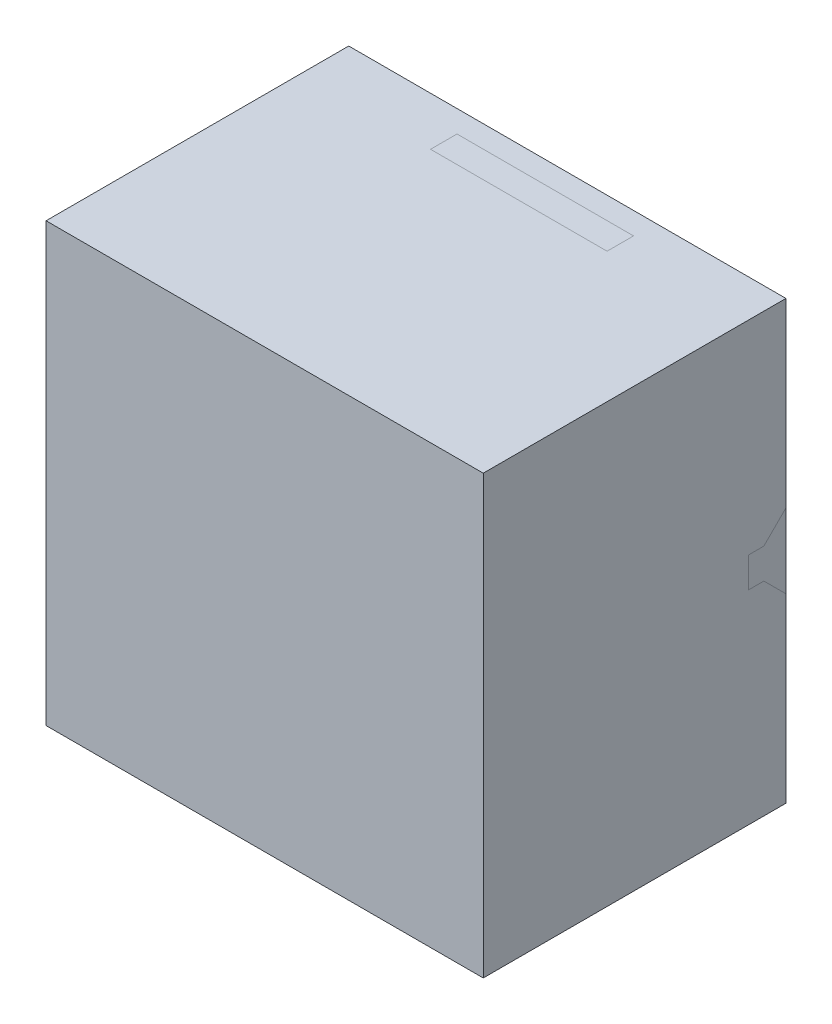
ISO-10303-21;
HEADER;
FILE_DESCRIPTION(('STEP AP214'),'2;1');
FILE_NAME('part.step','',(''),(''),'','','');
FILE_SCHEMA(('AUTOMOTIVE_DESIGN { 1 0 10303 214 1 1 1 1 }'));
ENDSEC;
DATA;
#1=APPLICATION_CONTEXT('core data for automotive mechanical design processes');
#2=APPLICATION_PROTOCOL_DEFINITION('international standard','automotive_design',2000,#1);
#3=PRODUCT_CONTEXT('',#1,'mechanical');
#4=PRODUCT('Part','Part','',(#3));
#5=PRODUCT_RELATED_PRODUCT_CATEGORY('part','',(#4));
#6=PRODUCT_DEFINITION_FORMATION('','',#4);
#7=PRODUCT_DEFINITION_CONTEXT('part definition',#1,'design');
#8=PRODUCT_DEFINITION('design','',#6,#7);
#9=PRODUCT_DEFINITION_SHAPE('','',#8);
#10=(LENGTH_UNIT() NAMED_UNIT(*) SI_UNIT(.MILLI.,.METRE.));
#11=(NAMED_UNIT(*) PLANE_ANGLE_UNIT() SI_UNIT($,.RADIAN.));
#12=(NAMED_UNIT(*) SI_UNIT($,.STERADIAN.) SOLID_ANGLE_UNIT());
#13=UNCERTAINTY_MEASURE_WITH_UNIT(LENGTH_MEASURE(1.E-05),#10,'distance_accuracy_value','');
#14=(GEOMETRIC_REPRESENTATION_CONTEXT(3) GLOBAL_UNCERTAINTY_ASSIGNED_CONTEXT((#13)) GLOBAL_UNIT_ASSIGNED_CONTEXT((#10,
#11,#12)) REPRESENTATION_CONTEXT('',''));
#15=CARTESIAN_POINT('',(0.,0.,0.));
#16=DIRECTION('',(0.,0.,1.));
#17=DIRECTION('',(1.,0.,0.));
#18=AXIS2_PLACEMENT_3D('',#15,#16,#17);
#19=CARTESIAN_POINT('',(49.53,49.53,68.58));
#20=DIRECTION('',(-1.,0.,0.));
#21=DIRECTION('',(0.,-1.,0.));
#22=AXIS2_PLACEMENT_3D('',#19,#20,#21);
#23=PLANE('',#22);
#24=DIRECTION('',(0.,-0.707106781186549,0.707106781186546));
#25=VECTOR('',#24,1.);
#26=CARTESIAN_POINT('',(49.53,-5.31049999999991,13.7394999999999));
#27=LINE('',#26,#25);
#28=CARTESIAN_POINT('',(49.53,8.42900000000003,0.));
#29=VERTEX_POINT('',#28);
#30=CARTESIAN_POINT('',(49.53,3.42900000000001,5.));
#31=VERTEX_POINT('',#30);
#32=EDGE_CURVE('E11',#29,#31,#27,.T.);
#33=ORIENTED_EDGE('',*,*,#32,.F.);
#34=DIRECTION('',(0.,1.,0.));
#35=VECTOR('',#34,1.);
#36=CARTESIAN_POINT('',(49.53,49.53,0.));
#37=LINE('',#36,#35);
#38=CARTESIAN_POINT('',(49.53,49.53,0.));
#39=VERTEX_POINT('',#38);
#40=EDGE_CURVE('E188',#29,#39,#37,.T.);
#41=ORIENTED_EDGE('',*,*,#40,.T.);
#42=DIRECTION('',(0.,0.,-1.));
#43=VECTOR('',#42,1.);
#44=CARTESIAN_POINT('',(49.53,49.53,68.58));
#45=LINE('',#44,#43);
#46=CARTESIAN_POINT('',(49.53,49.53,68.58));
#47=VERTEX_POINT('',#46);
#48=EDGE_CURVE('E168',#47,#39,#45,.T.);
#49=ORIENTED_EDGE('',*,*,#48,.F.);
#50=DIRECTION('',(0.,1.,0.));
#51=VECTOR('',#50,1.);
#52=CARTESIAN_POINT('',(49.53,49.53,68.58));
#53=LINE('',#52,#51);
#54=CARTESIAN_POINT('',(49.53,-49.53,68.58));
#55=VERTEX_POINT('',#54);
#56=EDGE_CURVE('E175',#55,#47,#53,.T.);
#57=ORIENTED_EDGE('',*,*,#56,.F.);
#58=DIRECTION('',(0.,0.,-1.));
#59=VECTOR('',#58,1.);
#60=CARTESIAN_POINT('',(49.53,-49.53,68.58));
#61=LINE('',#60,#59);
#62=CARTESIAN_POINT('',(49.53,-49.53,0.));
#63=VERTEX_POINT('',#62);
#64=EDGE_CURVE('E378',#55,#63,#61,.T.);
#65=ORIENTED_EDGE('',*,*,#64,.T.);
#66=CARTESIAN_POINT('',(49.53,-8.42900000000003,0.));
#67=VERTEX_POINT('',#66);
#68=EDGE_CURVE('E357',#63,#67,#37,.T.);
#69=ORIENTED_EDGE('',*,*,#68,.T.);
#70=DIRECTION('',(0.,-0.707106781186549,-0.707106781186546));
#71=VECTOR('',#70,1.);
#72=CARTESIAN_POINT('',(49.53,54.8405000000001,63.2694999999999));
#73=LINE('',#72,#71);
#74=CARTESIAN_POINT('',(49.53,-3.42900000000001,5.));
#75=VERTEX_POINT('',#74);
#76=EDGE_CURVE('E266',#75,#67,#73,.T.);
#77=ORIENTED_EDGE('',*,*,#76,.F.);
#78=DIRECTION('',(0.,0.,-1.));
#79=VECTOR('',#78,1.);
#80=CARTESIAN_POINT('',(49.53,-3.42899999999999,68.58));
#81=LINE('',#80,#79);
#82=CARTESIAN_POINT('',(49.53,-3.42899999999999,8.429));
#83=VERTEX_POINT('',#82);
#84=EDGE_CURVE('E269',#83,#75,#81,.T.);
#85=ORIENTED_EDGE('',*,*,#84,.F.);
#86=DIRECTION('',(0.,-1.,0.));
#87=VECTOR('',#86,1.);
#88=CARTESIAN_POINT('',(49.53,49.53,8.429));
#89=LINE('',#88,#87);
#90=CARTESIAN_POINT('',(49.53,3.42900000000001,8.429));
#91=VERTEX_POINT('',#90);
#92=EDGE_CURVE('E272',#91,#83,#89,.T.);
#93=ORIENTED_EDGE('',*,*,#92,.F.);
#94=DIRECTION('',(0.,0.,1.));
#95=VECTOR('',#94,1.);
#96=CARTESIAN_POINT('',(49.53,3.42900000000001,68.58));
#97=LINE('',#96,#95);
#98=EDGE_CURVE('E55',#31,#91,#97,.T.);
#99=ORIENTED_EDGE('',*,*,#98,.F.);
#100=EDGE_LOOP('',(#33,#41,#49,#57,#65,#69,#77,#85,#93,#99));
#101=FACE_BOUND('',#100,.T.);
#102=ADVANCED_FACE('F46',(#101),#23,.F.);
#103=CARTESIAN_POINT('',(-49.53,49.53,68.58));
#104=DIRECTION('',(0.,-1.,0.));
#105=DIRECTION('',(0.,0.,-1.));
#106=AXIS2_PLACEMENT_3D('',#103,#104,#105);
#107=PLANE('',#106);
#108=DIRECTION('',(-1.,0.,0.));
#109=VECTOR('',#108,1.);
#110=CARTESIAN_POINT('',(-49.53,49.53,0.));
#111=LINE('',#110,#109);
#112=CARTESIAN_POINT('',(-49.53,49.53,0.));
#113=VERTEX_POINT('',#112);
#114=EDGE_CURVE('E367',#39,#113,#111,.T.);
#115=ORIENTED_EDGE('',*,*,#114,.T.);
#116=DIRECTION('',(0.,0.,-1.));
#117=VECTOR('',#116,1.);
#118=CARTESIAN_POINT('',(-49.53,49.53,68.58));
#119=LINE('',#118,#117);
#120=CARTESIAN_POINT('',(-49.53,49.53,68.58));
#121=VERTEX_POINT('',#120);
#122=EDGE_CURVE('E170',#121,#113,#119,.T.);
#123=ORIENTED_EDGE('',*,*,#122,.F.);
#124=DIRECTION('',(-1.,0.,0.));
#125=VECTOR('',#124,1.);
#126=CARTESIAN_POINT('',(-49.53,49.53,68.58));
#127=LINE('',#126,#125);
#128=EDGE_CURVE('E163',#47,#121,#127,.T.);
#129=ORIENTED_EDGE('',*,*,#128,.F.);
#130=ORIENTED_EDGE('',*,*,#48,.T.);
#131=EDGE_LOOP('',(#115,#123,#129,#130));
#132=FACE_BOUND('',#131,.T.);
#133=DIRECTION('',(0.,0.,1.));
#134=VECTOR('',#133,1.);
#135=CARTESIAN_POINT('',(-20.,49.53,68.58));
#136=LINE('',#135,#134);
#137=CARTESIAN_POINT('',(-20.,49.53,5.00000000000002));
#138=VERTEX_POINT('',#137);
#139=CARTESIAN_POINT('',(-20.,49.53,11.));
#140=VERTEX_POINT('',#139);
#141=EDGE_CURVE('E263',#138,#140,#136,.T.);
#142=ORIENTED_EDGE('',*,*,#141,.F.);
#143=DIRECTION('',(-1.,0.,0.));
#144=VECTOR('',#143,1.);
#145=CARTESIAN_POINT('',(-49.53,49.53,5.00000000000002));
#146=LINE('',#145,#144);
#147=CARTESIAN_POINT('',(20.,49.53,5.00000000000002));
#148=VERTEX_POINT('',#147);
#149=EDGE_CURVE('E253',#148,#138,#146,.T.);
#150=ORIENTED_EDGE('',*,*,#149,.F.);
#151=DIRECTION('',(0.,0.,-1.));
#152=VECTOR('',#151,1.);
#153=CARTESIAN_POINT('',(20.,49.53,68.58));
#154=LINE('',#153,#152);
#155=CARTESIAN_POINT('',(20.,49.53,11.));
#156=VERTEX_POINT('',#155);
#157=EDGE_CURVE('E257',#156,#148,#154,.T.);
#158=ORIENTED_EDGE('',*,*,#157,.F.);
#159=DIRECTION('',(1.,0.,0.));
#160=VECTOR('',#159,1.);
#161=CARTESIAN_POINT('',(-49.53,49.53,11.));
#162=LINE('',#161,#160);
#163=EDGE_CURVE('E260',#140,#156,#162,.T.);
#164=ORIENTED_EDGE('',*,*,#163,.F.);
#165=EDGE_LOOP('',(#142,#150,#158,#164));
#166=FACE_BOUND('',#165,.T.);
#167=ADVANCED_FACE('F165',(#132,#166),#107,.F.);
#168=CARTESIAN_POINT('',(-49.53,49.53,68.58));
#169=DIRECTION('',(1.,0.,0.));
#170=DIRECTION('',(0.,1.,0.));
#171=AXIS2_PLACEMENT_3D('',#168,#169,#170);
#172=PLANE('',#171);
#173=CARTESIAN_POINT('',(-49.53,-21.9833914790969,31.3953335520591));
#174=DIRECTION('',(1.,0.,0.));
#175=DIRECTION('',(0.,1.,0.));
#176=AXIS2_PLACEMENT_3D('',#173,#174,#175);
#177=CIRCLE('',#176,6.91833197341886);
#178=CARTESIAN_POINT('',(-49.53,-15.065059505678,31.3953335520591));
#179=VERTEX_POINT('',#178);
#180=EDGE_CURVE('E236',#179,#179,#177,.F.);
#181=ORIENTED_EDGE('',*,*,#180,.F.);
#182=EDGE_LOOP('',(#181));
#183=FACE_BOUND('',#182,.T.);
#184=DIRECTION('',(0.,0.,-1.));
#185=VECTOR('',#184,1.);
#186=CARTESIAN_POINT('',(-49.53,-15.065059505678,68.58));
#187=LINE('',#186,#185);
#188=CARTESIAN_POINT('',(-49.53,-15.065059505678,53.735712572944));
#189=VERTEX_POINT('',#188);
#190=CARTESIAN_POINT('',(-49.53,-15.065059505678,39.1675779674298));
#191=VERTEX_POINT('',#190);
#192=EDGE_CURVE('E233',#189,#191,#187,.T.);
#193=ORIENTED_EDGE('',*,*,#192,.F.);
#194=DIRECTION('',(0.,1.,0.));
#195=VECTOR('',#194,1.);
#196=CARTESIAN_POINT('',(-49.53,49.53,53.735712572944));
#197=LINE('',#196,#195);
#198=CARTESIAN_POINT('',(-49.53,-33.2789971849568,53.735712572944));
#199=VERTEX_POINT('',#198);
#200=EDGE_CURVE('E223',#199,#189,#197,.T.);
#201=ORIENTED_EDGE('',*,*,#200,.F.);
#202=DIRECTION('',(0.,0.,1.));
#203=VECTOR('',#202,1.);
#204=CARTESIAN_POINT('',(-49.53,-33.2789971849568,68.58));
#205=LINE('',#204,#203);
#206=CARTESIAN_POINT('',(-49.53,-33.2789971849568,39.1675779674298));
#207=VERTEX_POINT('',#206);
#208=EDGE_CURVE('E227',#207,#199,#205,.T.);
#209=ORIENTED_EDGE('',*,*,#208,.F.);
#210=DIRECTION('',(0.,-1.,0.));
#211=VECTOR('',#210,1.);
#212=CARTESIAN_POINT('',(-49.53,49.53,39.1675779674298));
#213=LINE('',#212,#211);
#214=EDGE_CURVE('E230',#191,#207,#213,.T.);
#215=ORIENTED_EDGE('',*,*,#214,.F.);
#216=EDGE_LOOP('',(#193,#201,#209,#215));
#217=FACE_BOUND('',#216,.T.);
#218=DIRECTION('',(0.,-1.,0.));
#219=VECTOR('',#218,1.);
#220=CARTESIAN_POINT('',(-49.53,49.53,59.055));
#221=LINE('',#220,#219);
#222=CARTESIAN_POINT('',(-49.53,34.29,59.055));
#223=VERTEX_POINT('',#222);
#224=CARTESIAN_POINT('',(-49.53,-34.29,59.055));
#225=VERTEX_POINT('',#224);
#226=EDGE_CURVE('E207',#223,#225,#221,.T.);
#227=ORIENTED_EDGE('',*,*,#226,.F.);
#228=DIRECTION('',(0.,0.,-1.));
#229=VECTOR('',#228,1.);
#230=CARTESIAN_POINT('',(-49.53,34.29,68.58));
#231=LINE('',#230,#229);
#232=CARTESIAN_POINT('',(-49.53,34.29,65.405));
#233=VERTEX_POINT('',#232);
#234=EDGE_CURVE('E191',#233,#223,#231,.T.);
#235=ORIENTED_EDGE('',*,*,#234,.F.);
#236=DIRECTION('',(0.,1.,0.));
#237=VECTOR('',#236,1.);
#238=CARTESIAN_POINT('',(-49.53,49.53,65.405));
#239=LINE('',#238,#237);
#240=CARTESIAN_POINT('',(-49.53,-34.29,65.405));
#241=VERTEX_POINT('',#240);
#242=EDGE_CURVE('E196',#241,#233,#239,.T.);
#243=ORIENTED_EDGE('',*,*,#242,.F.);
#244=DIRECTION('',(0.,0.,1.));
#245=VECTOR('',#244,1.);
#246=CARTESIAN_POINT('',(-49.53,-34.29,68.58));
#247=LINE('',#246,#245);
#248=EDGE_CURVE('E204',#225,#241,#247,.T.);
#249=ORIENTED_EDGE('',*,*,#248,.F.);
#250=EDGE_LOOP('',(#227,#235,#243,#249));
#251=FACE_BOUND('',#250,.T.);
#252=DIRECTION('',(0.,-1.,0.));
#253=VECTOR('',#252,1.);
#254=CARTESIAN_POINT('',(-49.53,49.53,0.));
#255=LINE('',#254,#253);
#256=CARTESIAN_POINT('',(-49.53,-49.53,0.));
#257=VERTEX_POINT('',#256);
#258=EDGE_CURVE('E373',#113,#257,#255,.T.);
#259=ORIENTED_EDGE('',*,*,#258,.T.);
#260=DIRECTION('',(0.,0.,-1.));
#261=VECTOR('',#260,1.);
#262=CARTESIAN_POINT('',(-49.53,-49.53,68.58));
#263=LINE('',#262,#261);
#264=CARTESIAN_POINT('',(-49.53,-49.53,68.58));
#265=VERTEX_POINT('',#264);
#266=EDGE_CURVE('E198',#265,#257,#263,.T.);
#267=ORIENTED_EDGE('',*,*,#266,.F.);
#268=DIRECTION('',(0.,-1.,0.));
#269=VECTOR('',#268,1.);
#270=CARTESIAN_POINT('',(-49.53,49.53,68.58));
#271=LINE('',#270,#269);
#272=EDGE_CURVE('E174',#121,#265,#271,.T.);
#273=ORIENTED_EDGE('',*,*,#272,.F.);
#274=ORIENTED_EDGE('',*,*,#122,.T.);
#275=EDGE_LOOP('',(#259,#267,#273,#274));
#276=FACE_BOUND('',#275,.T.);
#277=DIRECTION('',(0.,-1.,0.));
#278=VECTOR('',#277,1.);
#279=CARTESIAN_POINT('',(-49.53,49.53,22.9737894492445));
#280=LINE('',#279,#278);
#281=CARTESIAN_POINT('',(-49.53,34.0803020450621,22.9737894492445));
#282=VERTEX_POINT('',#281);
#283=CARTESIAN_POINT('',(-49.53,-12.2746979549379,22.9737894492445));
#284=VERTEX_POINT('',#283);
#285=EDGE_CURVE('E220',#282,#284,#280,.T.);
#286=ORIENTED_EDGE('',*,*,#285,.F.);
#287=DIRECTION('',(0.,0.,-1.));
#288=VECTOR('',#287,1.);
#289=CARTESIAN_POINT('',(-49.53,34.0803020450621,68.58));
#290=LINE('',#289,#288);
#291=CARTESIAN_POINT('',(-49.53,34.0803020450621,51.5237150325915));
#292=VERTEX_POINT('',#291);
#293=EDGE_CURVE('E210',#292,#282,#290,.T.);
#294=ORIENTED_EDGE('',*,*,#293,.F.);
#295=DIRECTION('',(0.,1.,0.));
#296=VECTOR('',#295,1.);
#297=CARTESIAN_POINT('',(-49.53,49.53,51.5237150325915));
#298=LINE('',#297,#296);
#299=CARTESIAN_POINT('',(-49.53,-12.2746979549379,51.5237150325915));
#300=VERTEX_POINT('',#299);
#301=EDGE_CURVE('E214',#300,#292,#298,.T.);
#302=ORIENTED_EDGE('',*,*,#301,.F.);
#303=DIRECTION('',(0.,0.,1.));
#304=VECTOR('',#303,1.);
#305=CARTESIAN_POINT('',(-49.53,-12.2746979549379,68.58));
#306=LINE('',#305,#304);
#307=EDGE_CURVE('E217',#284,#300,#306,.T.);
#308=ORIENTED_EDGE('',*,*,#307,.F.);
#309=EDGE_LOOP('',(#286,#294,#302,#308));
#310=FACE_BOUND('',#309,.T.);
#311=DIRECTION('',(0.,0.,-1.));
#312=VECTOR('',#311,1.);
#313=CARTESIAN_POINT('',(-49.53,39.583984455087,68.58));
#314=LINE('',#313,#312);
#315=CARTESIAN_POINT('',(-49.53,39.583984455087,19.7319548024756));
#316=VERTEX_POINT('',#315);
#317=CARTESIAN_POINT('',(-49.53,39.583984455087,9.08096337334348));
#318=VERTEX_POINT('',#317);
#319=EDGE_CURVE('E250',#316,#318,#314,.T.);
#320=ORIENTED_EDGE('',*,*,#319,.F.);
#321=DIRECTION('',(0.,1.,0.));
#322=VECTOR('',#321,1.);
#323=CARTESIAN_POINT('',(-49.53,49.53,19.7319548024756));
#324=LINE('',#323,#322);
#325=CARTESIAN_POINT('',(-49.53,-39.651135160333,19.7319548024756));
#326=VERTEX_POINT('',#325);
#327=EDGE_CURVE('E240',#326,#316,#324,.T.);
#328=ORIENTED_EDGE('',*,*,#327,.F.);
#329=DIRECTION('',(0.,0.,1.));
#330=VECTOR('',#329,1.);
#331=CARTESIAN_POINT('',(-49.53,-39.651135160333,68.5799999999999));
#332=LINE('',#331,#330);
#333=CARTESIAN_POINT('',(-49.53,-39.651135160333,9.08096337334348));
#334=VERTEX_POINT('',#333);
#335=EDGE_CURVE('E244',#334,#326,#332,.T.);
#336=ORIENTED_EDGE('',*,*,#335,.F.);
#337=DIRECTION('',(0.,-1.,0.));
#338=VECTOR('',#337,1.);
#339=CARTESIAN_POINT('',(-49.53,49.53,9.08096337334348));
#340=LINE('',#339,#338);
#341=EDGE_CURVE('E247',#318,#334,#340,.T.);
#342=ORIENTED_EDGE('',*,*,#341,.F.);
#343=EDGE_LOOP('',(#320,#328,#336,#342));
#344=FACE_BOUND('',#343,.T.);
#345=ADVANCED_FACE('F387',(#183,#217,#251,#276,#310,#344),#172,.F.);
#346=ORIENTED_EDGE('',*,*,#327,.T.);
#347=ORIENTED_EDGE('',*,*,#319,.T.);
#348=ORIENTED_EDGE('',*,*,#341,.T.);
#349=ORIENTED_EDGE('',*,*,#335,.T.);
#350=EDGE_LOOP('',(#346,#347,#348,#349));
#351=FACE_BOUND('',#350,.T.);
#352=ADVANCED_FACE('F392',(#351),#172,.F.);
#353=ORIENTED_EDGE('',*,*,#180,.T.);
#354=EDGE_LOOP('',(#353));
#355=FACE_BOUND('',#354,.T.);
#356=ADVANCED_FACE('F404',(#355),#172,.F.);
#357=ORIENTED_EDGE('',*,*,#200,.T.);
#358=ORIENTED_EDGE('',*,*,#192,.T.);
#359=ORIENTED_EDGE('',*,*,#214,.T.);
#360=ORIENTED_EDGE('',*,*,#208,.T.);
#361=EDGE_LOOP('',(#357,#358,#359,#360));
#362=FACE_BOUND('',#361,.T.);
#363=ADVANCED_FACE('F408',(#362),#172,.F.);
#364=ORIENTED_EDGE('',*,*,#293,.T.);
#365=ORIENTED_EDGE('',*,*,#285,.T.);
#366=ORIENTED_EDGE('',*,*,#307,.T.);
#367=ORIENTED_EDGE('',*,*,#301,.T.);
#368=EDGE_LOOP('',(#364,#365,#366,#367));
#369=FACE_BOUND('',#368,.T.);
#370=ADVANCED_FACE('F417',(#369),#172,.F.);
#371=EDGE_CURVE('E359',#67,#29,#37,.T.);
#372=ORIENTED_EDGE('',*,*,#371,.T.);
#373=ORIENTED_EDGE('',*,*,#32,.T.);
#374=ORIENTED_EDGE('',*,*,#98,.T.);
#375=ORIENTED_EDGE('',*,*,#92,.T.);
#376=ORIENTED_EDGE('',*,*,#84,.T.);
#377=ORIENTED_EDGE('',*,*,#76,.T.);
#378=EDGE_LOOP('',(#372,#373,#374,#375,#376,#377));
#379=FACE_BOUND('',#378,.T.);
#380=ADVANCED_FACE('F48',(#379),#23,.F.);
#381=ORIENTED_EDGE('',*,*,#149,.T.);
#382=ORIENTED_EDGE('',*,*,#141,.T.);
#383=ORIENTED_EDGE('',*,*,#163,.T.);
#384=ORIENTED_EDGE('',*,*,#157,.T.);
#385=EDGE_LOOP('',(#381,#382,#383,#384));
#386=FACE_BOUND('',#385,.T.);
#387=ADVANCED_FACE('F415',(#386),#107,.F.);
#388=ORIENTED_EDGE('',*,*,#234,.T.);
#389=ORIENTED_EDGE('',*,*,#226,.T.);
#390=ORIENTED_EDGE('',*,*,#248,.T.);
#391=ORIENTED_EDGE('',*,*,#242,.T.);
#392=EDGE_LOOP('',(#388,#389,#390,#391));
#393=FACE_BOUND('',#392,.T.);
#394=ADVANCED_FACE('F395',(#393),#172,.F.);
#395=CARTESIAN_POINT('',(-49.53,-49.53,68.58));
#396=DIRECTION('',(0.,1.,0.));
#397=DIRECTION('',(0.,0.,1.));
#398=AXIS2_PLACEMENT_3D('',#395,#396,#397);
#399=PLANE('',#398);
#400=DIRECTION('',(1.,0.,0.));
#401=VECTOR('',#400,1.);
#402=CARTESIAN_POINT('',(-49.53,-49.53,0.));
#403=LINE('',#402,#401);
#404=EDGE_CURVE('E185',#257,#63,#403,.T.);
#405=ORIENTED_EDGE('',*,*,#404,.T.);
#406=ORIENTED_EDGE('',*,*,#64,.F.);
#407=DIRECTION('',(1.,0.,0.));
#408=VECTOR('',#407,1.);
#409=CARTESIAN_POINT('',(-49.53,-49.53,68.58));
#410=LINE('',#409,#408);
#411=EDGE_CURVE('E180',#265,#55,#410,.T.);
#412=ORIENTED_EDGE('',*,*,#411,.F.);
#413=ORIENTED_EDGE('',*,*,#266,.T.);
#414=EDGE_LOOP('',(#405,#406,#412,#413));
#415=FACE_BOUND('',#414,.T.);
#416=ADVANCED_FACE('F384',(#415),#399,.F.);
#417=CARTESIAN_POINT('',(0.,0.,68.58));
#418=DIRECTION('',(0.,0.,1.));
#419=DIRECTION('',(1.,0.,0.));
#420=AXIS2_PLACEMENT_3D('',#417,#418,#419);
#421=PLANE('',#420);
#422=ORIENTED_EDGE('',*,*,#56,.T.);
#423=ORIENTED_EDGE('',*,*,#128,.T.);
#424=ORIENTED_EDGE('',*,*,#272,.T.);
#425=ORIENTED_EDGE('',*,*,#411,.T.);
#426=EDGE_LOOP('',(#422,#423,#424,#425));
#427=FACE_BOUND('',#426,.T.);
#428=ADVANCED_FACE('F178',(#427),#421,.T.);
#429=CARTESIAN_POINT('',(0.,0.,0.));
#430=DIRECTION('',(0.,0.,1.));
#431=DIRECTION('',(1.,0.,0.));
#432=AXIS2_PLACEMENT_3D('',#429,#430,#431);
#433=PLANE('',#432);
#434=ORIENTED_EDGE('',*,*,#68,.F.);
#435=ORIENTED_EDGE('',*,*,#404,.F.);
#436=ORIENTED_EDGE('',*,*,#258,.F.);
#437=ORIENTED_EDGE('',*,*,#114,.F.);
#438=ORIENTED_EDGE('',*,*,#40,.F.);
#439=ORIENTED_EDGE('',*,*,#371,.F.);
#440=EDGE_LOOP('',(#434,#435,#436,#437,#438,#439));
#441=FACE_BOUND('',#440,.T.);
#442=ADVANCED_FACE('F361',(#441),#433,.F.);
#443=CLOSED_SHELL('',(#102,#167,#345,#352,#356,#363,#370,#380,#387,#394,#416,#428,#442));
#444=MANIFOLD_SOLID_BREP('B2',#443);
#445=ADVANCED_BREP_SHAPE_REPRESENTATION('',(#18,#444),#14);
#446=SHAPE_DEFINITION_REPRESENTATION(#9,#445);
ENDSEC;
END-ISO-10303-21;
